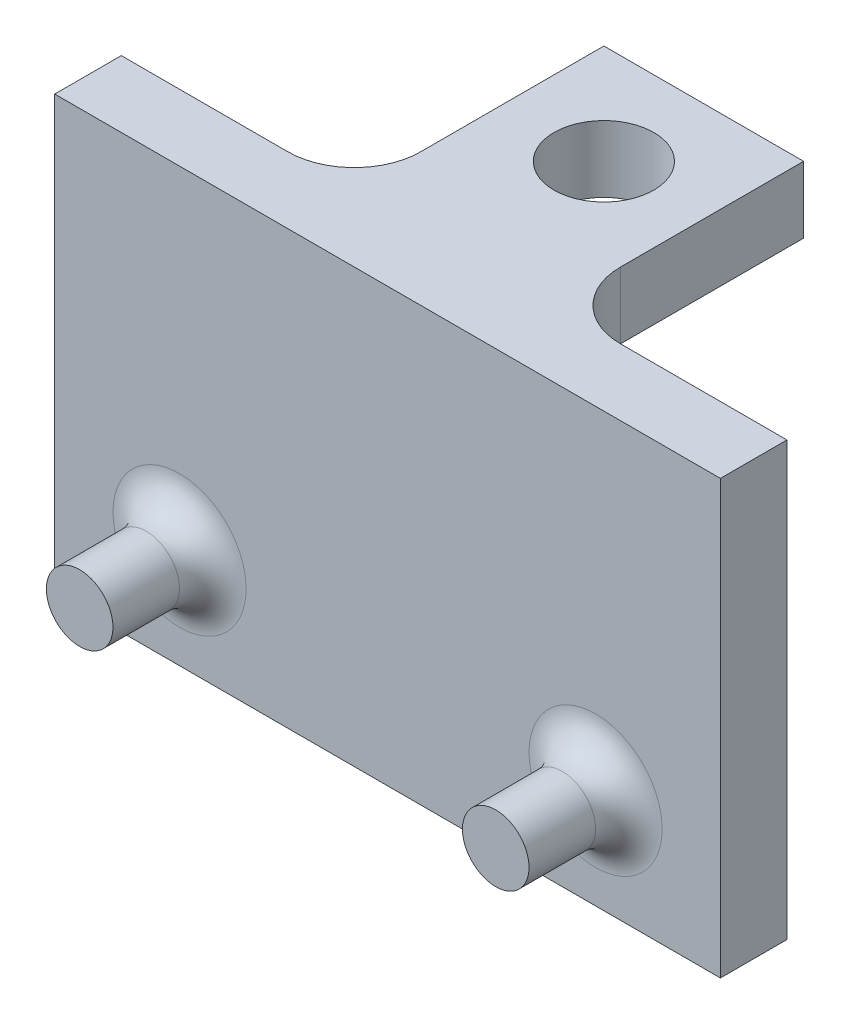
ISO-10303-21;
HEADER;
FILE_DESCRIPTION(('STEP AP214'),'2;1');
FILE_NAME('part.step','',(''),(''),'','','');
FILE_SCHEMA(('AUTOMOTIVE_DESIGN { 1 0 10303 214 1 1 1 1 }'));
ENDSEC;
DATA;
#1=APPLICATION_CONTEXT('core data for automotive mechanical design processes');
#2=APPLICATION_PROTOCOL_DEFINITION('international standard','automotive_design',2000,#1);
#3=PRODUCT_CONTEXT('',#1,'mechanical');
#4=PRODUCT('Part','Part','',(#3));
#5=PRODUCT_RELATED_PRODUCT_CATEGORY('part','',(#4));
#6=PRODUCT_DEFINITION_FORMATION('','',#4);
#7=PRODUCT_DEFINITION_CONTEXT('part definition',#1,'design');
#8=PRODUCT_DEFINITION('design','',#6,#7);
#9=PRODUCT_DEFINITION_SHAPE('','',#8);
#10=(LENGTH_UNIT() NAMED_UNIT(*) SI_UNIT(.MILLI.,.METRE.));
#11=(NAMED_UNIT(*) PLANE_ANGLE_UNIT() SI_UNIT($,.RADIAN.));
#12=(NAMED_UNIT(*) SI_UNIT($,.STERADIAN.) SOLID_ANGLE_UNIT());
#13=UNCERTAINTY_MEASURE_WITH_UNIT(LENGTH_MEASURE(1.E-05),#10,'distance_accuracy_value','');
#14=(GEOMETRIC_REPRESENTATION_CONTEXT(3) GLOBAL_UNCERTAINTY_ASSIGNED_CONTEXT((#13)) GLOBAL_UNIT_ASSIGNED_CONTEXT((#10,
#11,#12)) REPRESENTATION_CONTEXT('',''));
#15=CARTESIAN_POINT('',(0.,0.,0.));
#16=DIRECTION('',(0.,0.,1.));
#17=DIRECTION('',(1.,0.,0.));
#18=AXIS2_PLACEMENT_3D('',#15,#16,#17);
#19=CARTESIAN_POINT('',(0.,0.,2.));
#20=DIRECTION('',(1.,0.,0.));
#21=DIRECTION('',(0.,0.,-1.));
#22=AXIS2_PLACEMENT_3D('',#19,#20,#21);
#23=PLANE('',#22);
#24=DIRECTION('',(0.,-1.,0.));
#25=VECTOR('',#24,1.);
#26=CARTESIAN_POINT('',(0.,0.,0.));
#27=LINE('',#26,#25);
#28=CARTESIAN_POINT('',(0.,13.,0.));
#29=VERTEX_POINT('',#28);
#30=CARTESIAN_POINT('',(0.,0.,0.));
#31=VERTEX_POINT('',#30);
#32=EDGE_CURVE('E134',#29,#31,#27,.T.);
#33=ORIENTED_EDGE('',*,*,#32,.T.);
#34=DIRECTION('',(0.,0.,-1.));
#35=VECTOR('',#34,1.);
#36=CARTESIAN_POINT('',(0.,0.,2.));
#37=LINE('',#36,#35);
#38=CARTESIAN_POINT('',(0.,0.,2.));
#39=VERTEX_POINT('',#38);
#40=EDGE_CURVE('E214',#39,#31,#37,.T.);
#41=ORIENTED_EDGE('',*,*,#40,.F.);
#42=DIRECTION('',(0.,-1.,0.));
#43=VECTOR('',#42,1.);
#44=CARTESIAN_POINT('',(0.,0.,2.));
#45=LINE('',#44,#43);
#46=CARTESIAN_POINT('',(0.,13.,2.));
#47=VERTEX_POINT('',#46);
#48=EDGE_CURVE('E145',#47,#39,#45,.T.);
#49=ORIENTED_EDGE('',*,*,#48,.F.);
#50=DIRECTION('',(0.,0.,1.));
#51=VECTOR('',#50,1.);
#52=CARTESIAN_POINT('',(0.,13.,0.));
#53=LINE('',#52,#51);
#54=EDGE_CURVE('E123',#29,#47,#53,.T.);
#55=ORIENTED_EDGE('',*,*,#54,.F.);
#56=EDGE_LOOP('',(#33,#41,#49,#55));
#57=FACE_BOUND('',#56,.T.);
#58=ADVANCED_FACE('F39',(#57),#23,.F.);
#59=CARTESIAN_POINT('',(0.,0.,2.));
#60=DIRECTION('',(0.,1.,0.));
#61=DIRECTION('',(0.,0.,1.));
#62=AXIS2_PLACEMENT_3D('',#59,#60,#61);
#63=PLANE('',#62);
#64=DIRECTION('',(1.,0.,0.));
#65=VECTOR('',#64,1.);
#66=CARTESIAN_POINT('',(0.,0.,0.));
#67=LINE('',#66,#65);
#68=CARTESIAN_POINT('',(20.,0.,0.));
#69=VERTEX_POINT('',#68);
#70=EDGE_CURVE('E137',#31,#69,#67,.T.);
#71=ORIENTED_EDGE('',*,*,#70,.T.);
#72=DIRECTION('',(0.,0.,-1.));
#73=VECTOR('',#72,1.);
#74=CARTESIAN_POINT('',(20.,0.,2.));
#75=LINE('',#74,#73);
#76=CARTESIAN_POINT('',(20.,0.,2.));
#77=VERTEX_POINT('',#76);
#78=EDGE_CURVE('E202',#77,#69,#75,.T.);
#79=ORIENTED_EDGE('',*,*,#78,.F.);
#80=DIRECTION('',(1.,0.,0.));
#81=VECTOR('',#80,1.);
#82=CARTESIAN_POINT('',(0.,0.,2.));
#83=LINE('',#82,#81);
#84=EDGE_CURVE('E196',#39,#77,#83,.T.);
#85=ORIENTED_EDGE('',*,*,#84,.F.);
#86=ORIENTED_EDGE('',*,*,#40,.T.);
#87=EDGE_LOOP('',(#71,#79,#85,#86));
#88=FACE_BOUND('',#87,.T.);
#89=ADVANCED_FACE('F262',(#88),#63,.F.);
#90=CARTESIAN_POINT('',(20.,0.,2.));
#91=DIRECTION('',(-1.,0.,0.));
#92=DIRECTION('',(0.,-1.,0.));
#93=AXIS2_PLACEMENT_3D('',#90,#91,#92);
#94=PLANE('',#93);
#95=DIRECTION('',(0.,1.,0.));
#96=VECTOR('',#95,1.);
#97=CARTESIAN_POINT('',(20.,0.,0.));
#98=LINE('',#97,#96);
#99=CARTESIAN_POINT('',(20.,13.,0.));
#100=VERTEX_POINT('',#99);
#101=EDGE_CURVE('E206',#69,#100,#98,.T.);
#102=ORIENTED_EDGE('',*,*,#101,.T.);
#103=DIRECTION('',(0.,0.,-1.));
#104=VECTOR('',#103,1.);
#105=CARTESIAN_POINT('',(20.,13.,2.));
#106=LINE('',#105,#104);
#107=CARTESIAN_POINT('',(20.,13.,2.));
#108=VERTEX_POINT('',#107);
#109=EDGE_CURVE('E150',#108,#100,#106,.T.);
#110=ORIENTED_EDGE('',*,*,#109,.F.);
#111=DIRECTION('',(0.,1.,0.));
#112=VECTOR('',#111,1.);
#113=CARTESIAN_POINT('',(20.,0.,2.));
#114=LINE('',#113,#112);
#115=EDGE_CURVE('E200',#77,#108,#114,.T.);
#116=ORIENTED_EDGE('',*,*,#115,.F.);
#117=ORIENTED_EDGE('',*,*,#78,.T.);
#118=EDGE_LOOP('',(#102,#110,#116,#117));
#119=FACE_BOUND('',#118,.T.);
#120=ADVANCED_FACE('F259',(#119),#94,.F.);
#121=CARTESIAN_POINT('',(0.,0.,2.));
#122=DIRECTION('',(0.,0.,-1.));
#123=DIRECTION('',(-1.,0.,0.));
#124=AXIS2_PLACEMENT_3D('',#121,#122,#123);
#125=PLANE('',#124);
#126=CARTESIAN_POINT('',(3.75,3.,2.));
#127=DIRECTION('',(0.,0.,-1.));
#128=DIRECTION('',(-1.,0.,0.));
#129=AXIS2_PLACEMENT_3D('',#126,#127,#128);
#130=CIRCLE('',#129,2.);
#131=CARTESIAN_POINT('',(1.75,3.,2.));
#132=VERTEX_POINT('',#131);
#133=EDGE_CURVE('E225',#132,#132,#130,.T.);
#134=ORIENTED_EDGE('',*,*,#133,.T.);
#135=EDGE_LOOP('',(#134));
#136=FACE_BOUND('',#135,.T.);
#137=CARTESIAN_POINT('',(16.25,3.,2.));
#138=DIRECTION('',(0.,0.,-1.));
#139=DIRECTION('',(-1.,0.,0.));
#140=AXIS2_PLACEMENT_3D('',#137,#138,#139);
#141=CIRCLE('',#140,2.);
#142=CARTESIAN_POINT('',(14.25,3.,2.));
#143=VERTEX_POINT('',#142);
#144=EDGE_CURVE('E221',#143,#143,#141,.T.);
#145=ORIENTED_EDGE('',*,*,#144,.T.);
#146=EDGE_LOOP('',(#145));
#147=FACE_BOUND('',#146,.T.);
#148=ORIENTED_EDGE('',*,*,#48,.T.);
#149=ORIENTED_EDGE('',*,*,#84,.T.);
#150=ORIENTED_EDGE('',*,*,#115,.T.);
#151=DIRECTION('',(1.,0.,0.));
#152=VECTOR('',#151,1.);
#153=CARTESIAN_POINT('',(0.,13.,2.));
#154=LINE('',#153,#152);
#155=EDGE_CURVE('E147',#47,#108,#154,.T.);
#156=ORIENTED_EDGE('',*,*,#155,.F.);
#157=EDGE_LOOP('',(#148,#149,#150,#156));
#158=FACE_BOUND('',#157,.T.);
#159=ADVANCED_FACE('F264',(#136,#147,#158),#125,.F.);
#160=CARTESIAN_POINT('',(0.,0.,0.));
#161=DIRECTION('',(0.,0.,-1.));
#162=DIRECTION('',(-1.,0.,0.));
#163=AXIS2_PLACEMENT_3D('',#160,#161,#162);
#164=PLANE('',#163);
#165=DIRECTION('',(-1.,0.,0.));
#166=VECTOR('',#165,1.);
#167=CARTESIAN_POINT('',(7.00000000000001,13.,0.));
#168=LINE('',#167,#166);
#169=CARTESIAN_POINT('',(5.00000000000001,13.,0.));
#170=VERTEX_POINT('',#169);
#171=EDGE_CURVE('E116',#170,#29,#168,.T.);
#172=ORIENTED_EDGE('',*,*,#171,.F.);
#173=DIRECTION('',(0.,-1.,0.));
#174=VECTOR('',#173,1.);
#175=CARTESIAN_POINT('',(5.00000000000001,0.,0.));
#176=LINE('',#175,#174);
#177=CARTESIAN_POINT('',(5.00000000000001,11.,0.));
#178=VERTEX_POINT('',#177);
#179=EDGE_CURVE('E236',#170,#178,#176,.T.);
#180=ORIENTED_EDGE('',*,*,#179,.T.);
#181=DIRECTION('',(-1.,0.,0.));
#182=VECTOR('',#181,1.);
#183=CARTESIAN_POINT('',(0.,11.,0.));
#184=LINE('',#183,#182);
#185=CARTESIAN_POINT('',(15.,11.,0.));
#186=VERTEX_POINT('',#185);
#187=EDGE_CURVE('E197',#186,#178,#184,.T.);
#188=ORIENTED_EDGE('',*,*,#187,.F.);
#189=DIRECTION('',(0.,-1.,0.));
#190=VECTOR('',#189,1.);
#191=CARTESIAN_POINT('',(15.,0.,0.));
#192=LINE('',#191,#190);
#193=CARTESIAN_POINT('',(15.,13.,0.));
#194=VERTEX_POINT('',#193);
#195=EDGE_CURVE('E233',#186,#194,#192,.F.);
#196=ORIENTED_EDGE('',*,*,#195,.T.);
#197=DIRECTION('',(-1.,0.,0.));
#198=VECTOR('',#197,1.);
#199=CARTESIAN_POINT('',(20.,13.,0.));
#200=LINE('',#199,#198);
#201=EDGE_CURVE('E157',#100,#194,#200,.T.);
#202=ORIENTED_EDGE('',*,*,#201,.F.);
#203=ORIENTED_EDGE('',*,*,#101,.F.);
#204=ORIENTED_EDGE('',*,*,#70,.F.);
#205=ORIENTED_EDGE('',*,*,#32,.F.);
#206=EDGE_LOOP('',(#172,#180,#188,#196,#202,#203,#204,#205));
#207=FACE_BOUND('',#206,.T.);
#208=ADVANCED_FACE('F135',(#207),#164,.T.);
#209=CARTESIAN_POINT('',(16.25,3.,5.));
#210=DIRECTION('',(0.,0.,-1.));
#211=DIRECTION('',(-1.,0.,0.));
#212=AXIS2_PLACEMENT_3D('',#209,#210,#211);
#213=CYLINDRICAL_SURFACE('',#212,1.);
#214=CARTESIAN_POINT('',(16.25,3.,3.));
#215=DIRECTION('',(0.,0.,-1.));
#216=DIRECTION('',(-1.,0.,0.));
#217=AXIS2_PLACEMENT_3D('',#214,#215,#216);
#218=CIRCLE('',#217,1.);
#219=CARTESIAN_POINT('',(15.25,3.,3.));
#220=VERTEX_POINT('',#219);
#221=EDGE_CURVE('E229',#220,#220,#218,.F.);
#222=ORIENTED_EDGE('',*,*,#221,.T.);
#223=EDGE_LOOP('',(#222));
#224=FACE_BOUND('',#223,.T.);
#225=CARTESIAN_POINT('',(16.25,3.,5.));
#226=DIRECTION('',(0.,0.,1.));
#227=DIRECTION('',(1.,0.,0.));
#228=AXIS2_PLACEMENT_3D('',#225,#226,#227);
#229=CIRCLE('',#228,1.);
#230=CARTESIAN_POINT('',(17.25,3.,5.));
#231=VERTEX_POINT('',#230);
#232=EDGE_CURVE('E142',#231,#231,#229,.T.);
#233=ORIENTED_EDGE('',*,*,#232,.F.);
#234=EDGE_LOOP('',(#233));
#235=FACE_BOUND('',#234,.T.);
#236=ADVANCED_FACE('F272',(#224,#235),#213,.T.);
#237=CARTESIAN_POINT('',(16.25,3.,5.));
#238=DIRECTION('',(0.,0.,1.));
#239=DIRECTION('',(1.,0.,0.));
#240=AXIS2_PLACEMENT_3D('',#237,#238,#239);
#241=PLANE('',#240);
#242=ORIENTED_EDGE('',*,*,#232,.T.);
#243=EDGE_LOOP('',(#242));
#244=FACE_BOUND('',#243,.T.);
#245=ADVANCED_FACE('F330',(#244),#241,.T.);
#246=CARTESIAN_POINT('',(3.75,3.,5.));
#247=DIRECTION('',(0.,0.,-1.));
#248=DIRECTION('',(-1.,0.,0.));
#249=AXIS2_PLACEMENT_3D('',#246,#247,#248);
#250=CYLINDRICAL_SURFACE('',#249,1.);
#251=CARTESIAN_POINT('',(3.75,3.,3.));
#252=DIRECTION('',(0.,0.,-1.));
#253=DIRECTION('',(-1.,0.,0.));
#254=AXIS2_PLACEMENT_3D('',#251,#252,#253);
#255=CIRCLE('',#254,1.);
#256=CARTESIAN_POINT('',(2.75,3.,3.));
#257=VERTEX_POINT('',#256);
#258=EDGE_CURVE('E217',#257,#257,#255,.F.);
#259=ORIENTED_EDGE('',*,*,#258,.T.);
#260=EDGE_LOOP('',(#259));
#261=FACE_BOUND('',#260,.T.);
#262=CARTESIAN_POINT('',(3.75,3.,5.));
#263=DIRECTION('',(0.,0.,1.));
#264=DIRECTION('',(1.,0.,0.));
#265=AXIS2_PLACEMENT_3D('',#262,#263,#264);
#266=CIRCLE('',#265,1.);
#267=CARTESIAN_POINT('',(4.75,3.,5.));
#268=VERTEX_POINT('',#267);
#269=EDGE_CURVE('E187',#268,#268,#266,.T.);
#270=ORIENTED_EDGE('',*,*,#269,.F.);
#271=EDGE_LOOP('',(#270));
#272=FACE_BOUND('',#271,.T.);
#273=ADVANCED_FACE('F326',(#261,#272),#250,.T.);
#274=CARTESIAN_POINT('',(3.75,3.,5.));
#275=DIRECTION('',(0.,0.,1.));
#276=DIRECTION('',(1.,0.,0.));
#277=AXIS2_PLACEMENT_3D('',#274,#275,#276);
#278=PLANE('',#277);
#279=ORIENTED_EDGE('',*,*,#269,.T.);
#280=EDGE_LOOP('',(#279));
#281=FACE_BOUND('',#280,.T.);
#282=ADVANCED_FACE('F288',(#281),#278,.T.);
#283=CARTESIAN_POINT('',(3.75,3.,3.));
#284=DIRECTION('',(0.,0.,-1.));
#285=DIRECTION('',(-1.,0.,0.));
#286=AXIS2_PLACEMENT_3D('',#283,#284,#285);
#287=TOROIDAL_SURFACE('',#286,2.,1.);
#288=ORIENTED_EDGE('',*,*,#133,.F.);
#289=EDGE_LOOP('',(#288));
#290=FACE_BOUND('',#289,.T.);
#291=ORIENTED_EDGE('',*,*,#258,.F.);
#292=EDGE_LOOP('',(#291));
#293=FACE_BOUND('',#292,.T.);
#294=ADVANCED_FACE('F284',(#290,#293),#287,.F.);
#295=CARTESIAN_POINT('',(16.25,3.,3.));
#296=DIRECTION('',(0.,0.,-1.));
#297=DIRECTION('',(-1.,0.,0.));
#298=AXIS2_PLACEMENT_3D('',#295,#296,#297);
#299=TOROIDAL_SURFACE('',#298,2.,1.);
#300=ORIENTED_EDGE('',*,*,#144,.F.);
#301=EDGE_LOOP('',(#300));
#302=FACE_BOUND('',#301,.T.);
#303=ORIENTED_EDGE('',*,*,#221,.F.);
#304=EDGE_LOOP('',(#303));
#305=FACE_BOUND('',#304,.T.);
#306=ADVANCED_FACE('F287',(#302,#305),#299,.F.);
#307=CARTESIAN_POINT('',(0.,11.,0.));
#308=DIRECTION('',(0.,1.,0.));
#309=DIRECTION('',(0.,0.,1.));
#310=AXIS2_PLACEMENT_3D('',#307,#308,#309);
#311=PLANE('',#310);
#312=CARTESIAN_POINT('',(10.,11.,-4.5));
#313=DIRECTION('',(0.,1.,0.));
#314=DIRECTION('',(0.,0.,1.));
#315=AXIS2_PLACEMENT_3D('',#312,#313,#314);
#316=CIRCLE('',#315,1.5);
#317=CARTESIAN_POINT('',(10.,11.,-3.));
#318=VERTEX_POINT('',#317);
#319=EDGE_CURVE('E467',#318,#318,#316,.T.);
#320=ORIENTED_EDGE('',*,*,#319,.T.);
#321=EDGE_LOOP('',(#320));
#322=FACE_BOUND('',#321,.T.);
#323=DIRECTION('',(0.,0.,-1.));
#324=VECTOR('',#323,1.);
#325=CARTESIAN_POINT('',(13.,11.,0.));
#326=LINE('',#325,#324);
#327=CARTESIAN_POINT('',(13.,11.,-2.));
#328=VERTEX_POINT('',#327);
#329=CARTESIAN_POINT('',(13.,11.,-7.5));
#330=VERTEX_POINT('',#329);
#331=EDGE_CURVE('E170',#328,#330,#326,.T.);
#332=ORIENTED_EDGE('',*,*,#331,.F.);
#333=CARTESIAN_POINT('',(15.,11.,-2.));
#334=DIRECTION('',(0.,1.,0.));
#335=DIRECTION('',(0.,0.,1.));
#336=AXIS2_PLACEMENT_3D('',#333,#334,#335);
#337=CIRCLE('',#336,2.);
#338=EDGE_CURVE('E48',#328,#186,#337,.T.);
#339=ORIENTED_EDGE('',*,*,#338,.T.);
#340=ORIENTED_EDGE('',*,*,#187,.T.);
#341=CARTESIAN_POINT('',(5.00000000000001,11.,-2.));
#342=DIRECTION('',(0.,1.,0.));
#343=DIRECTION('',(0.,0.,1.));
#344=AXIS2_PLACEMENT_3D('',#341,#342,#343);
#345=CIRCLE('',#344,2.);
#346=CARTESIAN_POINT('',(7.00000000000001,11.,-2.));
#347=VERTEX_POINT('',#346);
#348=EDGE_CURVE('E245',#178,#347,#345,.T.);
#349=ORIENTED_EDGE('',*,*,#348,.T.);
#350=DIRECTION('',(0.,0.,1.));
#351=VECTOR('',#350,1.);
#352=CARTESIAN_POINT('',(7.,11.,-7.5));
#353=LINE('',#352,#351);
#354=CARTESIAN_POINT('',(7.,11.,-7.5));
#355=VERTEX_POINT('',#354);
#356=EDGE_CURVE('E131',#355,#347,#353,.T.);
#357=ORIENTED_EDGE('',*,*,#356,.F.);
#358=DIRECTION('',(-1.,0.,0.));
#359=VECTOR('',#358,1.);
#360=CARTESIAN_POINT('',(13.,11.,-7.5));
#361=LINE('',#360,#359);
#362=EDGE_CURVE('E173',#330,#355,#361,.T.);
#363=ORIENTED_EDGE('',*,*,#362,.F.);
#364=EDGE_LOOP('',(#332,#339,#340,#349,#357,#363));
#365=FACE_BOUND('',#364,.T.);
#366=ADVANCED_FACE('F252',(#322,#365),#311,.F.);
#367=CARTESIAN_POINT('',(0.,13.,0.));
#368=DIRECTION('',(0.,1.,0.));
#369=DIRECTION('',(0.,0.,1.));
#370=AXIS2_PLACEMENT_3D('',#367,#368,#369);
#371=PLANE('',#370);
#372=DIRECTION('',(0.,0.,1.));
#373=VECTOR('',#372,1.);
#374=CARTESIAN_POINT('',(7.,13.,-7.5));
#375=LINE('',#374,#373);
#376=CARTESIAN_POINT('',(7.,13.,-7.5));
#377=VERTEX_POINT('',#376);
#378=CARTESIAN_POINT('',(7.00000000000001,13.,-2.));
#379=VERTEX_POINT('',#378);
#380=EDGE_CURVE('E166',#377,#379,#375,.T.);
#381=ORIENTED_EDGE('',*,*,#380,.T.);
#382=CARTESIAN_POINT('',(5.00000000000001,13.,-2.));
#383=DIRECTION('',(0.,1.,0.));
#384=DIRECTION('',(0.,0.,1.));
#385=AXIS2_PLACEMENT_3D('',#382,#383,#384);
#386=CIRCLE('',#385,2.);
#387=EDGE_CURVE('E126',#379,#170,#386,.F.);
#388=ORIENTED_EDGE('',*,*,#387,.T.);
#389=ORIENTED_EDGE('',*,*,#171,.T.);
#390=ORIENTED_EDGE('',*,*,#54,.T.);
#391=ORIENTED_EDGE('',*,*,#155,.T.);
#392=ORIENTED_EDGE('',*,*,#109,.T.);
#393=ORIENTED_EDGE('',*,*,#201,.T.);
#394=CARTESIAN_POINT('',(15.,13.,-2.));
#395=DIRECTION('',(0.,1.,0.));
#396=DIRECTION('',(0.,0.,1.));
#397=AXIS2_PLACEMENT_3D('',#394,#395,#396);
#398=CIRCLE('',#397,2.);
#399=CARTESIAN_POINT('',(13.,13.,-2.));
#400=VERTEX_POINT('',#399);
#401=EDGE_CURVE('E11',#194,#400,#398,.F.);
#402=ORIENTED_EDGE('',*,*,#401,.T.);
#403=DIRECTION('',(0.,0.,-1.));
#404=VECTOR('',#403,1.);
#405=CARTESIAN_POINT('',(13.,13.,0.));
#406=LINE('',#405,#404);
#407=CARTESIAN_POINT('',(13.,13.,-7.5));
#408=VERTEX_POINT('',#407);
#409=EDGE_CURVE('E160',#400,#408,#406,.T.);
#410=ORIENTED_EDGE('',*,*,#409,.T.);
#411=DIRECTION('',(-1.,0.,0.));
#412=VECTOR('',#411,1.);
#413=CARTESIAN_POINT('',(13.,13.,-7.5));
#414=LINE('',#413,#412);
#415=EDGE_CURVE('E163',#408,#377,#414,.T.);
#416=ORIENTED_EDGE('',*,*,#415,.T.);
#417=EDGE_LOOP('',(#381,#388,#389,#390,#391,#392,#393,#402,#410,#416));
#418=FACE_BOUND('',#417,.T.);
#419=CARTESIAN_POINT('',(10.,13.,-4.5));
#420=DIRECTION('',(0.,1.,0.));
#421=DIRECTION('',(0.,0.,1.));
#422=AXIS2_PLACEMENT_3D('',#419,#420,#421);
#423=CIRCLE('',#422,1.5);
#424=CARTESIAN_POINT('',(10.,13.,-3.));
#425=VERTEX_POINT('',#424);
#426=EDGE_CURVE('E174',#425,#425,#423,.T.);
#427=ORIENTED_EDGE('',*,*,#426,.F.);
#428=EDGE_LOOP('',(#427));
#429=FACE_BOUND('',#428,.T.);
#430=ADVANCED_FACE('F119',(#418,#429),#371,.T.);
#431=CARTESIAN_POINT('',(13.,13.,0.));
#432=DIRECTION('',(-1.,0.,0.));
#433=DIRECTION('',(0.,0.,1.));
#434=AXIS2_PLACEMENT_3D('',#431,#432,#433);
#435=PLANE('',#434);
#436=ORIENTED_EDGE('',*,*,#409,.F.);
#437=DIRECTION('',(0.,-1.,0.));
#438=VECTOR('',#437,1.);
#439=CARTESIAN_POINT('',(13.,13.,-2.));
#440=LINE('',#439,#438);
#441=EDGE_CURVE('E242',#400,#328,#440,.T.);
#442=ORIENTED_EDGE('',*,*,#441,.T.);
#443=ORIENTED_EDGE('',*,*,#331,.T.);
#444=DIRECTION('',(0.,-1.,0.));
#445=VECTOR('',#444,1.);
#446=CARTESIAN_POINT('',(13.,13.,-7.5));
#447=LINE('',#446,#445);
#448=EDGE_CURVE('E183',#408,#330,#447,.T.);
#449=ORIENTED_EDGE('',*,*,#448,.F.);
#450=EDGE_LOOP('',(#436,#442,#443,#449));
#451=FACE_BOUND('',#450,.T.);
#452=ADVANCED_FACE('F313',(#451),#435,.F.);
#453=CARTESIAN_POINT('',(13.,13.,-7.5));
#454=DIRECTION('',(0.,0.,1.));
#455=DIRECTION('',(1.,0.,0.));
#456=AXIS2_PLACEMENT_3D('',#453,#454,#455);
#457=PLANE('',#456);
#458=ORIENTED_EDGE('',*,*,#362,.T.);
#459=DIRECTION('',(0.,-1.,0.));
#460=VECTOR('',#459,1.);
#461=CARTESIAN_POINT('',(7.,13.,-7.5));
#462=LINE('',#461,#460);
#463=EDGE_CURVE('E169',#377,#355,#462,.T.);
#464=ORIENTED_EDGE('',*,*,#463,.F.);
#465=ORIENTED_EDGE('',*,*,#415,.F.);
#466=ORIENTED_EDGE('',*,*,#448,.T.);
#467=EDGE_LOOP('',(#458,#464,#465,#466));
#468=FACE_BOUND('',#467,.T.);
#469=ADVANCED_FACE('F310',(#468),#457,.F.);
#470=CARTESIAN_POINT('',(7.,13.,-7.5));
#471=DIRECTION('',(1.,0.,0.));
#472=DIRECTION('',(0.,0.,-1.));
#473=AXIS2_PLACEMENT_3D('',#470,#471,#472);
#474=PLANE('',#473);
#475=ORIENTED_EDGE('',*,*,#356,.T.);
#476=DIRECTION('',(0.,-1.,0.));
#477=VECTOR('',#476,1.);
#478=CARTESIAN_POINT('',(7.00000000000001,13.,-2.));
#479=LINE('',#478,#477);
#480=EDGE_CURVE('E239',#347,#379,#479,.F.);
#481=ORIENTED_EDGE('',*,*,#480,.T.);
#482=ORIENTED_EDGE('',*,*,#380,.F.);
#483=ORIENTED_EDGE('',*,*,#463,.T.);
#484=EDGE_LOOP('',(#475,#481,#482,#483));
#485=FACE_BOUND('',#484,.T.);
#486=ADVANCED_FACE('F300',(#485),#474,.F.);
#487=CARTESIAN_POINT('',(10.,13.,-4.5));
#488=DIRECTION('',(0.,-1.,0.));
#489=DIRECTION('',(0.,0.,-1.));
#490=AXIS2_PLACEMENT_3D('',#487,#488,#489);
#491=CYLINDRICAL_SURFACE('',#490,1.5);
#492=ORIENTED_EDGE('',*,*,#426,.T.);
#493=EDGE_LOOP('',(#492));
#494=FACE_BOUND('',#493,.T.);
#495=ORIENTED_EDGE('',*,*,#319,.F.);
#496=EDGE_LOOP('',(#495));
#497=FACE_BOUND('',#496,.T.);
#498=ADVANCED_FACE('F294',(#494,#497),#491,.F.);
#499=CARTESIAN_POINT('',(5.00000000000001,0.,-2.));
#500=DIRECTION('',(0.,-1.,0.));
#501=DIRECTION('',(0.,0.,-1.));
#502=AXIS2_PLACEMENT_3D('',#499,#500,#501);
#503=CYLINDRICAL_SURFACE('',#502,2.);
#504=ORIENTED_EDGE('',*,*,#387,.F.);
#505=ORIENTED_EDGE('',*,*,#480,.F.);
#506=ORIENTED_EDGE('',*,*,#348,.F.);
#507=ORIENTED_EDGE('',*,*,#179,.F.);
#508=EDGE_LOOP('',(#504,#505,#506,#507));
#509=FACE_BOUND('',#508,.T.);
#510=ADVANCED_FACE('F292',(#509),#503,.F.);
#511=CARTESIAN_POINT('',(15.,13.,-2.));
#512=DIRECTION('',(0.,-1.,0.));
#513=DIRECTION('',(0.,0.,-1.));
#514=AXIS2_PLACEMENT_3D('',#511,#512,#513);
#515=CYLINDRICAL_SURFACE('',#514,2.);
#516=ORIENTED_EDGE('',*,*,#401,.F.);
#517=ORIENTED_EDGE('',*,*,#195,.F.);
#518=ORIENTED_EDGE('',*,*,#338,.F.);
#519=ORIENTED_EDGE('',*,*,#441,.F.);
#520=EDGE_LOOP('',(#516,#517,#518,#519));
#521=FACE_BOUND('',#520,.T.);
#522=ADVANCED_FACE('F41',(#521),#515,.F.);
#523=CLOSED_SHELL('',(#58,#89,#120,#159,#208,#236,#245,#273,#282,#294,#306,#366,#430,#452,#469,
#486,#498,#510,#522));
#524=MANIFOLD_SOLID_BREP('B2',#523);
#525=ADVANCED_BREP_SHAPE_REPRESENTATION('',(#18,#524),#14);
#526=SHAPE_DEFINITION_REPRESENTATION(#9,#525);
ENDSEC;
END-ISO-10303-21;
